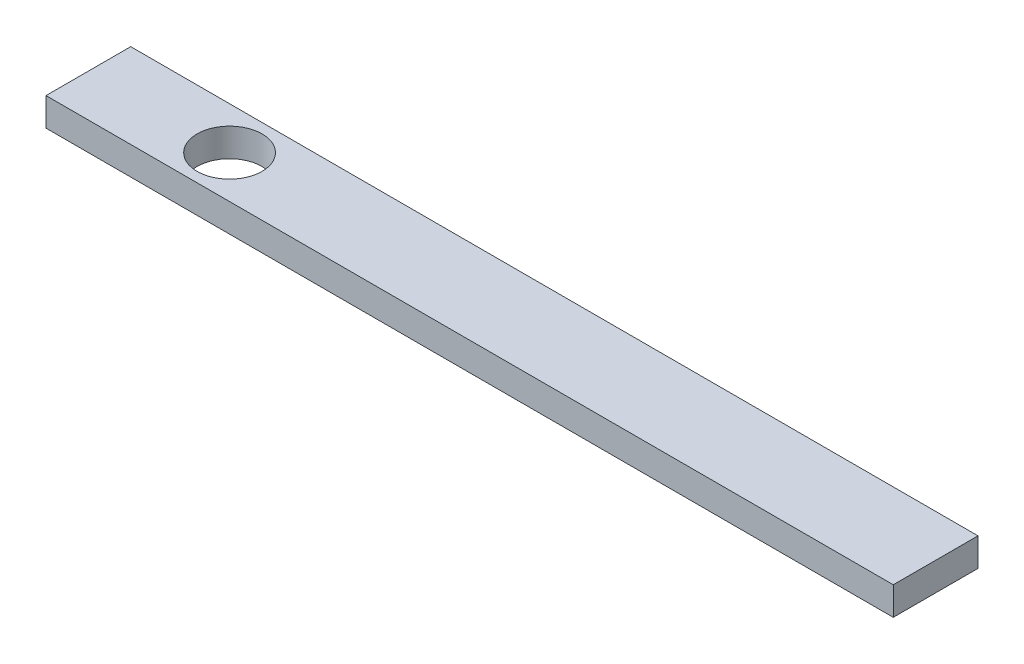
ISO-10303-21;
HEADER;
FILE_DESCRIPTION(('STEP AP214'),'2;1');
FILE_NAME('part.step','',(''),(''),'','','');
FILE_SCHEMA(('AUTOMOTIVE_DESIGN { 1 0 10303 214 1 1 1 1 }'));
ENDSEC;
DATA;
#1=APPLICATION_CONTEXT('core data for automotive mechanical design processes');
#2=APPLICATION_PROTOCOL_DEFINITION('international standard','automotive_design',2000,#1);
#3=PRODUCT_CONTEXT('',#1,'mechanical');
#4=PRODUCT('Part','Part','',(#3));
#5=PRODUCT_RELATED_PRODUCT_CATEGORY('part','',(#4));
#6=PRODUCT_DEFINITION_FORMATION('','',#4);
#7=PRODUCT_DEFINITION_CONTEXT('part definition',#1,'design');
#8=PRODUCT_DEFINITION('design','',#6,#7);
#9=PRODUCT_DEFINITION_SHAPE('','',#8);
#10=(LENGTH_UNIT() NAMED_UNIT(*) SI_UNIT(.MILLI.,.METRE.));
#11=(NAMED_UNIT(*) PLANE_ANGLE_UNIT() SI_UNIT($,.RADIAN.));
#12=(NAMED_UNIT(*) SI_UNIT($,.STERADIAN.) SOLID_ANGLE_UNIT());
#13=UNCERTAINTY_MEASURE_WITH_UNIT(LENGTH_MEASURE(1.E-05),#10,'distance_accuracy_value','');
#14=(GEOMETRIC_REPRESENTATION_CONTEXT(3) GLOBAL_UNCERTAINTY_ASSIGNED_CONTEXT((#13)) GLOBAL_UNIT_ASSIGNED_CONTEXT((#10,
#11,#12)) REPRESENTATION_CONTEXT('',''));
#15=CARTESIAN_POINT('',(0.,0.,0.));
#16=DIRECTION('',(0.,0.,1.));
#17=DIRECTION('',(1.,0.,0.));
#18=AXIS2_PLACEMENT_3D('',#15,#16,#17);
#19=CARTESIAN_POINT('',(0.,2.53999999999999,0.));
#20=DIRECTION('',(0.,0.999999999999998,0.));
#21=DIRECTION('',(0.,0.,0.999999999999999));
#22=AXIS2_PLACEMENT_3D('',#19,#20,#21);
#23=PLANE('',#22);
#24=DIRECTION('',(1.,0.,0.));
#25=VECTOR('',#24,1.);
#26=CARTESIAN_POINT('',(0.,2.53999999999999,0.));
#27=LINE('',#26,#25);
#28=CARTESIAN_POINT('',(0.,2.53999999999999,0.));
#29=VERTEX_POINT('',#28);
#30=CARTESIAN_POINT('',(76.1999999999999,2.53999999999999,0.));
#31=VERTEX_POINT('',#30);
#32=EDGE_CURVE('E80',#29,#31,#27,.T.);
#33=ORIENTED_EDGE('',*,*,#32,.T.);
#34=DIRECTION('',(0.,0.,-0.999999999999999));
#35=VECTOR('',#34,1.);
#36=CARTESIAN_POINT('',(76.1999999999999,2.53999999999999,0.));
#37=LINE('',#36,#35);
#38=CARTESIAN_POINT('',(76.1999999999999,2.54000000000001,-7.62000000000005));
#39=VERTEX_POINT('',#38);
#40=EDGE_CURVE('E75',#31,#39,#37,.T.);
#41=ORIENTED_EDGE('',*,*,#40,.T.);
#42=DIRECTION('',(-1.,0.,0.));
#43=VECTOR('',#42,1.);
#44=CARTESIAN_POINT('',(-1.11022302462516E-13,2.53999999999996,-7.62));
#45=LINE('',#44,#43);
#46=CARTESIAN_POINT('',(-1.11022302462516E-13,2.53999999999996,-7.62));
#47=VERTEX_POINT('',#46);
#48=EDGE_CURVE('E78',#39,#47,#45,.T.);
#49=ORIENTED_EDGE('',*,*,#48,.T.);
#50=DIRECTION('',(0.,0.,0.999999999999999));
#51=VECTOR('',#50,1.);
#52=CARTESIAN_POINT('',(0.,2.53999999999999,0.));
#53=LINE('',#52,#51);
#54=EDGE_CURVE('E45',#47,#29,#53,.T.);
#55=ORIENTED_EDGE('',*,*,#54,.T.);
#56=EDGE_LOOP('',(#33,#41,#49,#55));
#57=FACE_BOUND('',#56,.T.);
#58=CARTESIAN_POINT('',(12.6999999999999,2.54000000000001,-3.81000000000001));
#59=DIRECTION('',(0.,0.999999999999998,0.));
#60=DIRECTION('',(0.,0.,0.999999999999999));
#61=AXIS2_PLACEMENT_3D('',#58,#59,#60);
#62=CIRCLE('',#61,2.921);
#63=CARTESIAN_POINT('',(12.6999999999999,2.54000000000001,-6.73100000000001));
#64=VERTEX_POINT('',#63);
#65=EDGE_CURVE('E95',#64,#64,#62,.T.);
#66=ORIENTED_EDGE('',*,*,#65,.F.);
#67=EDGE_LOOP('',(#66));
#68=FACE_BOUND('',#67,.T.);
#69=ADVANCED_FACE('F28',(#57,#68),#23,.T.);
#70=CARTESIAN_POINT('',(0.,0.,0.));
#71=DIRECTION('',(0.,0.999999999999998,0.));
#72=DIRECTION('',(0.,0.,0.999999999999999));
#73=AXIS2_PLACEMENT_3D('',#70,#71,#72);
#74=PLANE('',#73);
#75=DIRECTION('',(1.,0.,0.));
#76=VECTOR('',#75,1.);
#77=CARTESIAN_POINT('',(0.,0.,0.));
#78=LINE('',#77,#76);
#79=CARTESIAN_POINT('',(0.,0.,0.));
#80=VERTEX_POINT('',#79);
#81=CARTESIAN_POINT('',(76.1999999999999,0.,0.));
#82=VERTEX_POINT('',#81);
#83=EDGE_CURVE('E92',#80,#82,#78,.T.);
#84=ORIENTED_EDGE('',*,*,#83,.F.);
#85=DIRECTION('',(0.,0.,0.999999999999999));
#86=VECTOR('',#85,1.);
#87=CARTESIAN_POINT('',(0.,0.,0.));
#88=LINE('',#87,#86);
#89=CARTESIAN_POINT('',(-1.11022302462516E-13,0.,-7.62000000000002));
#90=VERTEX_POINT('',#89);
#91=EDGE_CURVE('E68',#90,#80,#88,.T.);
#92=ORIENTED_EDGE('',*,*,#91,.F.);
#93=DIRECTION('',(-1.,0.,0.));
#94=VECTOR('',#93,1.);
#95=CARTESIAN_POINT('',(-1.11022302462516E-13,0.,-7.62000000000002));
#96=LINE('',#95,#94);
#97=CARTESIAN_POINT('',(76.1999999999999,0.,-7.62000000000004));
#98=VERTEX_POINT('',#97);
#99=EDGE_CURVE('E62',#98,#90,#96,.T.);
#100=ORIENTED_EDGE('',*,*,#99,.F.);
#101=DIRECTION('',(0.,0.,-0.999999999999999));
#102=VECTOR('',#101,1.);
#103=CARTESIAN_POINT('',(76.1999999999999,0.,0.));
#104=LINE('',#103,#102);
#105=EDGE_CURVE('E84',#82,#98,#104,.T.);
#106=ORIENTED_EDGE('',*,*,#105,.F.);
#107=EDGE_LOOP('',(#84,#92,#100,#106));
#108=FACE_BOUND('',#107,.T.);
#109=CARTESIAN_POINT('',(12.6999999999999,0.,-3.81000000000004));
#110=DIRECTION('',(0.,0.999999999999998,0.));
#111=DIRECTION('',(0.,0.,0.999999999999999));
#112=AXIS2_PLACEMENT_3D('',#109,#110,#111);
#113=CIRCLE('',#112,2.921);
#114=CARTESIAN_POINT('',(12.6999999999999,0.,-6.73100000000001));
#115=VERTEX_POINT('',#114);
#116=EDGE_CURVE('E107',#115,#115,#113,.T.);
#117=ORIENTED_EDGE('',*,*,#116,.T.);
#118=EDGE_LOOP('',(#117));
#119=FACE_BOUND('',#118,.T.);
#120=ADVANCED_FACE('F103',(#108,#119),#74,.F.);
#121=CARTESIAN_POINT('',(0.,2.53999999999999,0.));
#122=DIRECTION('',(0.,0.,-0.999999999999999));
#123=DIRECTION('',(-1.,0.,0.));
#124=AXIS2_PLACEMENT_3D('',#121,#122,#123);
#125=PLANE('',#124);
#126=ORIENTED_EDGE('',*,*,#83,.T.);
#127=DIRECTION('',(0.,-0.999999999999998,0.));
#128=VECTOR('',#127,1.);
#129=CARTESIAN_POINT('',(76.1999999999999,2.53999999999999,0.));
#130=LINE('',#129,#128);
#131=EDGE_CURVE('E11',#31,#82,#130,.T.);
#132=ORIENTED_EDGE('',*,*,#131,.F.);
#133=ORIENTED_EDGE('',*,*,#32,.F.);
#134=DIRECTION('',(0.,-0.999999999999998,0.));
#135=VECTOR('',#134,1.);
#136=CARTESIAN_POINT('',(0.,2.53999999999999,0.));
#137=LINE('',#136,#135);
#138=EDGE_CURVE('E88',#29,#80,#137,.T.);
#139=ORIENTED_EDGE('',*,*,#138,.T.);
#140=EDGE_LOOP('',(#126,#132,#133,#139));
#141=FACE_BOUND('',#140,.T.);
#142=ADVANCED_FACE('F30',(#141),#125,.F.);
#143=CARTESIAN_POINT('',(76.1999999999999,2.53999999999999,0.));
#144=DIRECTION('',(-1.,0.,0.));
#145=DIRECTION('',(0.,0.,0.999999999999999));
#146=AXIS2_PLACEMENT_3D('',#143,#144,#145);
#147=PLANE('',#146);
#148=ORIENTED_EDGE('',*,*,#105,.T.);
#149=DIRECTION('',(0.,-0.999999999999998,0.));
#150=VECTOR('',#149,1.);
#151=CARTESIAN_POINT('',(76.1999999999999,2.54000000000001,-7.62000000000005));
#152=LINE('',#151,#150);
#153=EDGE_CURVE('E37',#39,#98,#152,.T.);
#154=ORIENTED_EDGE('',*,*,#153,.F.);
#155=ORIENTED_EDGE('',*,*,#40,.F.);
#156=ORIENTED_EDGE('',*,*,#131,.T.);
#157=EDGE_LOOP('',(#148,#154,#155,#156));
#158=FACE_BOUND('',#157,.T.);
#159=ADVANCED_FACE('F83',(#158),#147,.F.);
#160=CARTESIAN_POINT('',(-1.11022302462516E-13,2.53999999999996,-7.62));
#161=DIRECTION('',(0.,0.,0.999999999999999));
#162=DIRECTION('',(1.,0.,0.));
#163=AXIS2_PLACEMENT_3D('',#160,#161,#162);
#164=PLANE('',#163);
#165=ORIENTED_EDGE('',*,*,#99,.T.);
#166=DIRECTION('',(0.,-0.999999999999998,0.));
#167=VECTOR('',#166,1.);
#168=CARTESIAN_POINT('',(-1.11022302462516E-13,2.53999999999996,-7.62));
#169=LINE('',#168,#167);
#170=EDGE_CURVE('E85',#47,#90,#169,.T.);
#171=ORIENTED_EDGE('',*,*,#170,.F.);
#172=ORIENTED_EDGE('',*,*,#48,.F.);
#173=ORIENTED_EDGE('',*,*,#153,.T.);
#174=EDGE_LOOP('',(#165,#171,#172,#173));
#175=FACE_BOUND('',#174,.T.);
#176=ADVANCED_FACE('F86',(#175),#164,.F.);
#177=CARTESIAN_POINT('',(0.,2.53999999999999,0.));
#178=DIRECTION('',(1.,0.,0.));
#179=DIRECTION('',(0.,0.,-0.999999999999999));
#180=AXIS2_PLACEMENT_3D('',#177,#178,#179);
#181=PLANE('',#180);
#182=ORIENTED_EDGE('',*,*,#91,.T.);
#183=ORIENTED_EDGE('',*,*,#138,.F.);
#184=ORIENTED_EDGE('',*,*,#54,.F.);
#185=ORIENTED_EDGE('',*,*,#170,.T.);
#186=EDGE_LOOP('',(#182,#183,#184,#185));
#187=FACE_BOUND('',#186,.T.);
#188=ADVANCED_FACE('F100',(#187),#181,.F.);
#189=CARTESIAN_POINT('',(12.6999999999999,2.54000000000001,-3.81000000000001));
#190=DIRECTION('',(0.,-0.999999999999998,0.));
#191=DIRECTION('',(0.,0.,-0.999999999999999));
#192=AXIS2_PLACEMENT_3D('',#189,#190,#191);
#193=CYLINDRICAL_SURFACE('',#192,2.921);
#194=CARTESIAN_POINT('',(12.6999999999999,2.54000000000001,-6.73100000000001));
#195=CARTESIAN_POINT('',(12.6999999999999,2.51354166666668,-6.73100000000001));
#196=CARTESIAN_POINT('',(12.6999999999999,2.48708333333335,-6.73100000000001));
#197=CARTESIAN_POINT('',(12.6999999999999,2.43416666666668,-6.73100000000001));
#198=CARTESIAN_POINT('',(12.6999999999999,2.40770833333335,-6.73100000000001));
#199=CARTESIAN_POINT('',(12.6999999999999,2.35479166666668,-6.73100000000001));
#200=CARTESIAN_POINT('',(12.6999999999999,2.32833333333335,-6.73100000000001));
#201=CARTESIAN_POINT('',(12.6999999999999,2.27541666666668,-6.73100000000001));
#202=CARTESIAN_POINT('',(12.6999999999999,2.24895833333334,-6.73100000000001));
#203=CARTESIAN_POINT('',(12.6999999999999,2.19604166666668,-6.73100000000001));
#204=CARTESIAN_POINT('',(12.6999999999999,2.16958333333334,-6.73100000000001));
#205=CARTESIAN_POINT('',(12.6999999999999,2.11666666666668,-6.73100000000001));
#206=CARTESIAN_POINT('',(12.6999999999999,2.09020833333334,-6.73100000000001));
#207=CARTESIAN_POINT('',(12.6999999999999,2.03729166666667,-6.73100000000001));
#208=CARTESIAN_POINT('',(12.6999999999999,2.01083333333334,-6.73100000000001));
#209=CARTESIAN_POINT('',(12.6999999999999,1.95791666666667,-6.73100000000001));
#210=CARTESIAN_POINT('',(12.6999999999999,1.93145833333334,-6.73100000000001));
#211=CARTESIAN_POINT('',(12.6999999999999,1.87854166666667,-6.73100000000001));
#212=CARTESIAN_POINT('',(12.6999999999999,1.85208333333334,-6.73100000000001));
#213=CARTESIAN_POINT('',(12.6999999999999,1.79916666666667,-6.73100000000001));
#214=CARTESIAN_POINT('',(12.6999999999999,1.77270833333334,-6.73100000000001));
#215=CARTESIAN_POINT('',(12.6999999999999,1.71979166666667,-6.73100000000001));
#216=CARTESIAN_POINT('',(12.6999999999999,1.69333333333333,-6.73100000000001));
#217=CARTESIAN_POINT('',(12.6999999999999,1.64041666666667,-6.73100000000001));
#218=CARTESIAN_POINT('',(12.6999999999999,1.61395833333333,-6.73100000000001));
#219=CARTESIAN_POINT('',(12.6999999999999,1.56104166666667,-6.73100000000001));
#220=CARTESIAN_POINT('',(12.6999999999999,1.53458333333333,-6.73100000000001));
#221=CARTESIAN_POINT('',(12.6999999999999,1.48166666666666,-6.73100000000001));
#222=CARTESIAN_POINT('',(12.6999999999999,1.45520833333333,-6.73100000000001));
#223=CARTESIAN_POINT('',(12.6999999999999,1.40229166666666,-6.73100000000001));
#224=CARTESIAN_POINT('',(12.6999999999999,1.37583333333333,-6.73100000000001));
#225=CARTESIAN_POINT('',(12.6999999999999,1.32291666666666,-6.73100000000001));
#226=CARTESIAN_POINT('',(12.6999999999999,1.29645833333333,-6.73100000000001));
#227=CARTESIAN_POINT('',(12.6999999999999,1.24354166666666,-6.73100000000001));
#228=CARTESIAN_POINT('',(12.6999999999999,1.21708333333333,-6.73100000000001));
#229=CARTESIAN_POINT('',(12.6999999999999,1.16416666666666,-6.73100000000001));
#230=CARTESIAN_POINT('',(12.6999999999999,1.13770833333333,-6.73100000000001));
#231=CARTESIAN_POINT('',(12.6999999999999,1.08479166666666,-6.73100000000001));
#232=CARTESIAN_POINT('',(12.6999999999999,1.05833333333332,-6.73100000000001));
#233=CARTESIAN_POINT('',(12.6999999999999,1.00541666666666,-6.73100000000001));
#234=CARTESIAN_POINT('',(12.6999999999999,0.978958333333323,-6.73100000000001));
#235=CARTESIAN_POINT('',(12.6999999999999,0.926041666666655,-6.73100000000001));
#236=CARTESIAN_POINT('',(12.6999999999999,0.899583333333322,-6.73100000000001));
#237=CARTESIAN_POINT('',(12.6999999999999,0.846666666666654,-6.73100000000001));
#238=CARTESIAN_POINT('',(12.6999999999999,0.82020833333332,-6.73100000000001));
#239=CARTESIAN_POINT('',(12.6999999999999,0.767291666666653,-6.73100000000001));
#240=CARTESIAN_POINT('',(12.6999999999999,0.740833333333319,-6.73100000000001));
#241=CARTESIAN_POINT('',(12.6999999999999,0.687916666666651,-6.73100000000001));
#242=CARTESIAN_POINT('',(12.6999999999999,0.661458333333318,-6.73100000000001));
#243=CARTESIAN_POINT('',(12.6999999999999,0.60854166666665,-6.73100000000001));
#244=CARTESIAN_POINT('',(12.6999999999999,0.582083333333316,-6.73100000000001));
#245=CARTESIAN_POINT('',(12.6999999999999,0.529166666666649,-6.73100000000001));
#246=CARTESIAN_POINT('',(12.6999999999999,0.502708333333315,-6.73100000000001));
#247=CARTESIAN_POINT('',(12.6999999999999,0.449791666666647,-6.73100000000001));
#248=CARTESIAN_POINT('',(12.6999999999999,0.423333333333314,-6.73100000000001));
#249=CARTESIAN_POINT('',(12.6999999999999,0.370416666666646,-6.73100000000001));
#250=CARTESIAN_POINT('',(12.6999999999999,0.343958333333312,-6.73100000000001));
#251=CARTESIAN_POINT('',(12.6999999999999,0.291041666666645,-6.73100000000001));
#252=CARTESIAN_POINT('',(12.6999999999999,0.264583333333311,-6.73100000000001));
#253=CARTESIAN_POINT('',(12.6999999999999,0.211666666666643,-6.73100000000001));
#254=CARTESIAN_POINT('',(12.6999999999999,0.18520833333331,-6.73100000000001));
#255=CARTESIAN_POINT('',(12.6999999999999,0.132291666666642,-6.73100000000001));
#256=CARTESIAN_POINT('',(12.6999999999999,0.105833333333308,-6.73100000000001));
#257=CARTESIAN_POINT('',(12.6999999999999,0.0529166666666407,-6.73100000000001));
#258=CARTESIAN_POINT('',(12.6999999999999,0.0264583333333069,-6.73100000000001));
#259=CARTESIAN_POINT('',(12.6999999999999,0.,-6.73100000000001));
#260=B_SPLINE_CURVE_WITH_KNOTS('',3,(#194,#195,#196,#197,#198,#199,#200,#201,#202,#203,#204,
#205,#206,#207,#208,#209,#210,#211,#212,#213,#214,#215,#216,#217,#218,#219,#220,#221,#222,#223,
#224,#225,#226,#227,#228,#229,#230,#231,#232,#233,#234,#235,#236,#237,#238,#239,#240,#241,#242,
#243,#244,#245,#246,#247,#248,#249,#250,#251,#252,#253,#254,#255,#256,#257,#258,#259),
.UNSPECIFIED.,.F.,.F.,(4,2,2,2,2,2,2,2,2,2,2,2,2,2,2,2,2,2,2,2,2,2,2,2,2,2,2,2,2,2,2,2,4),(0.,
0.0793750000000009,0.158750000000002,0.238125000000004,0.317500000000005,0.396875000000006,
0.476250000000008,0.555625000000009,0.63500000000001,0.714375000000011,0.793750000000013,
0.873125000000014,0.952500000000015,1.03187500000002,1.11125000000002,1.19062500000002,
1.27000000000002,1.34937500000002,1.42875000000002,1.50812500000002,1.58750000000003,
1.66687500000003,1.74625000000003,1.82562500000003,1.90500000000003,1.98437500000003,
2.06375000000003,2.14312500000004,2.22250000000004,2.30187500000004,2.38125000000004,
2.46062500000004,2.54000000000004),.UNSPECIFIED.);
#261=EDGE_CURVE('BSEAM113',#64,#115,#260,.T.);
#262=ORIENTED_EDGE('',*,*,#65,.T.);
#263=ORIENTED_EDGE('',*,*,#116,.F.);
#264=ORIENTED_EDGE('',*,*,#261,.T.);
#265=ORIENTED_EDGE('',*,*,#261,.F.);
#266=EDGE_LOOP('',(#262,#264,#263,#265));
#267=FACE_BOUND('',#266,.T.);
#268=ADVANCED_FACE('F113',(#267),#193,.F.);
#269=CLOSED_SHELL('',(#69,#120,#142,#159,#176,#188,#268));
#270=MANIFOLD_SOLID_BREP('B2',#269);
#271=ADVANCED_BREP_SHAPE_REPRESENTATION('',(#18,#270),#14);
#272=SHAPE_DEFINITION_REPRESENTATION(#9,#271);
ENDSEC;
END-ISO-10303-21;
